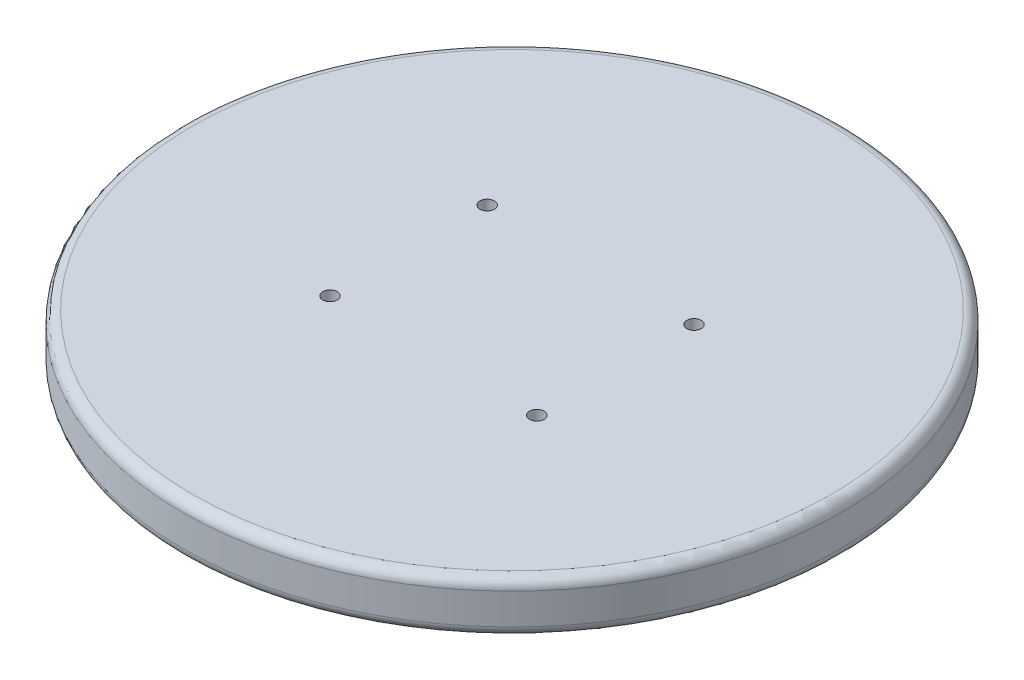
ISO-10303-21;
HEADER;
FILE_DESCRIPTION(('STEP AP214'),'2;1');
FILE_NAME('part.step','',(''),(''),'','','');
FILE_SCHEMA(('AUTOMOTIVE_DESIGN { 1 0 10303 214 1 1 1 1 }'));
ENDSEC;
DATA;
#1=APPLICATION_CONTEXT('core data for automotive mechanical design processes');
#2=APPLICATION_PROTOCOL_DEFINITION('international standard','automotive_design',2000,#1);
#3=PRODUCT_CONTEXT('',#1,'mechanical');
#4=PRODUCT('Part','Part','',(#3));
#5=PRODUCT_RELATED_PRODUCT_CATEGORY('part','',(#4));
#6=PRODUCT_DEFINITION_FORMATION('','',#4);
#7=PRODUCT_DEFINITION_CONTEXT('part definition',#1,'design');
#8=PRODUCT_DEFINITION('design','',#6,#7);
#9=PRODUCT_DEFINITION_SHAPE('','',#8);
#10=(LENGTH_UNIT() NAMED_UNIT(*) SI_UNIT(.MILLI.,.METRE.));
#11=(NAMED_UNIT(*) PLANE_ANGLE_UNIT() SI_UNIT($,.RADIAN.));
#12=(NAMED_UNIT(*) SI_UNIT($,.STERADIAN.) SOLID_ANGLE_UNIT());
#13=UNCERTAINTY_MEASURE_WITH_UNIT(LENGTH_MEASURE(1.E-05),#10,'distance_accuracy_value','');
#14=(GEOMETRIC_REPRESENTATION_CONTEXT(3) GLOBAL_UNCERTAINTY_ASSIGNED_CONTEXT((#13)) GLOBAL_UNIT_ASSIGNED_CONTEXT((#10,
#11,#12)) REPRESENTATION_CONTEXT('',''));
#15=CARTESIAN_POINT('',(0.,0.,0.));
#16=DIRECTION('',(0.,0.,1.));
#17=DIRECTION('',(1.,0.,0.));
#18=AXIS2_PLACEMENT_3D('',#15,#16,#17);
#19=CARTESIAN_POINT('',(0.,10.,0.));
#20=DIRECTION('',(0.,1.,0.));
#21=DIRECTION('',(0.,0.,1.));
#22=AXIS2_PLACEMENT_3D('',#19,#20,#21);
#23=PLANE('',#22);
#24=CARTESIAN_POINT('',(0.,10.,0.));
#25=DIRECTION('',(0.,1.,0.));
#26=DIRECTION('',(0.,0.,1.));
#27=AXIS2_PLACEMENT_3D('',#24,#25,#26);
#28=CIRCLE('',#27,61.7375421346438);
#29=CARTESIAN_POINT('',(0.,10.,61.7375421346438));
#30=VERTEX_POINT('',#29);
#31=EDGE_CURVE('E45',#30,#30,#28,.T.);
#32=ORIENTED_EDGE('',*,*,#31,.T.);
#33=EDGE_LOOP('',(#32));
#34=FACE_BOUND('',#33,.T.);
#35=CARTESIAN_POINT('',(-20.,10.,15.2));
#36=DIRECTION('',(0.,1.,0.));
#37=DIRECTION('',(0.,0.,-1.));
#38=AXIS2_PLACEMENT_3D('',#35,#36,#37);
#39=CIRCLE('',#38,1.4);
#40=CARTESIAN_POINT('',(-20.,10.,13.8));
#41=VERTEX_POINT('',#40);
#42=EDGE_CURVE('E74',#41,#41,#39,.T.);
#43=ORIENTED_EDGE('',*,*,#42,.F.);
#44=EDGE_LOOP('',(#43));
#45=FACE_BOUND('',#44,.T.);
#46=CARTESIAN_POINT('',(20.,10.,-15.2));
#47=DIRECTION('',(0.,1.,0.));
#48=DIRECTION('',(0.,0.,1.));
#49=AXIS2_PLACEMENT_3D('',#46,#47,#48);
#50=CIRCLE('',#49,1.4);
#51=CARTESIAN_POINT('',(20.,10.,-13.8));
#52=VERTEX_POINT('',#51);
#53=EDGE_CURVE('E61',#52,#52,#50,.T.);
#54=ORIENTED_EDGE('',*,*,#53,.F.);
#55=EDGE_LOOP('',(#54));
#56=FACE_BOUND('',#55,.T.);
#57=CARTESIAN_POINT('',(20.,10.,15.2));
#58=DIRECTION('',(0.,1.,0.));
#59=DIRECTION('',(0.,0.,1.));
#60=AXIS2_PLACEMENT_3D('',#57,#58,#59);
#61=CIRCLE('',#60,1.4);
#62=CARTESIAN_POINT('',(20.,10.,16.6));
#63=VERTEX_POINT('',#62);
#64=EDGE_CURVE('E66',#63,#63,#61,.T.);
#65=ORIENTED_EDGE('',*,*,#64,.F.);
#66=EDGE_LOOP('',(#65));
#67=FACE_BOUND('',#66,.T.);
#68=CARTESIAN_POINT('',(-20.,10.,-15.2));
#69=DIRECTION('',(0.,1.,0.));
#70=DIRECTION('',(0.,0.,-1.));
#71=AXIS2_PLACEMENT_3D('',#68,#69,#70);
#72=CIRCLE('',#71,1.4);
#73=CARTESIAN_POINT('',(-20.,10.,-16.6));
#74=VERTEX_POINT('',#73);
#75=EDGE_CURVE('E82',#74,#74,#72,.T.);
#76=ORIENTED_EDGE('',*,*,#75,.F.);
#77=EDGE_LOOP('',(#76));
#78=FACE_BOUND('',#77,.T.);
#79=ADVANCED_FACE('F37',(#34,#45,#56,#67,#78),#23,.T.);
#80=CARTESIAN_POINT('',(0.,0.,0.));
#81=DIRECTION('',(0.,1.,0.));
#82=DIRECTION('',(0.,0.,1.));
#83=AXIS2_PLACEMENT_3D('',#80,#81,#82);
#84=PLANE('',#83);
#85=CARTESIAN_POINT('',(0.,0.,0.));
#86=DIRECTION('',(0.,1.,0.));
#87=DIRECTION('',(0.,0.,1.));
#88=AXIS2_PLACEMENT_3D('',#85,#86,#87);
#89=CIRCLE('',#88,61.7375421346438);
#90=CARTESIAN_POINT('',(0.,0.,61.7375421346438));
#91=VERTEX_POINT('',#90);
#92=EDGE_CURVE('E50',#91,#91,#89,.F.);
#93=ORIENTED_EDGE('',*,*,#92,.T.);
#94=EDGE_LOOP('',(#93));
#95=FACE_BOUND('',#94,.T.);
#96=CARTESIAN_POINT('',(20.,0.,-15.2));
#97=DIRECTION('',(0.,1.,0.));
#98=DIRECTION('',(0.,0.,1.));
#99=AXIS2_PLACEMENT_3D('',#96,#97,#98);
#100=CIRCLE('',#99,1.4);
#101=CARTESIAN_POINT('',(20.,0.,-13.8));
#102=VERTEX_POINT('',#101);
#103=EDGE_CURVE('E62',#102,#102,#100,.T.);
#104=ORIENTED_EDGE('',*,*,#103,.T.);
#105=EDGE_LOOP('',(#104));
#106=FACE_BOUND('',#105,.T.);
#107=CARTESIAN_POINT('',(20.,0.,15.2));
#108=DIRECTION('',(0.,1.,0.));
#109=DIRECTION('',(0.,0.,1.));
#110=AXIS2_PLACEMENT_3D('',#107,#108,#109);
#111=CIRCLE('',#110,1.4);
#112=CARTESIAN_POINT('',(20.,0.,16.6));
#113=VERTEX_POINT('',#112);
#114=EDGE_CURVE('E70',#113,#113,#111,.T.);
#115=ORIENTED_EDGE('',*,*,#114,.T.);
#116=EDGE_LOOP('',(#115));
#117=FACE_BOUND('',#116,.T.);
#118=CARTESIAN_POINT('',(-20.,0.,15.2));
#119=DIRECTION('',(0.,1.,0.));
#120=DIRECTION('',(0.,0.,-1.));
#121=AXIS2_PLACEMENT_3D('',#118,#119,#120);
#122=CIRCLE('',#121,1.4);
#123=CARTESIAN_POINT('',(-20.,0.,13.8));
#124=VERTEX_POINT('',#123);
#125=EDGE_CURVE('E78',#124,#124,#122,.T.);
#126=ORIENTED_EDGE('',*,*,#125,.T.);
#127=EDGE_LOOP('',(#126));
#128=FACE_BOUND('',#127,.T.);
#129=CARTESIAN_POINT('',(-20.,0.,-15.2));
#130=DIRECTION('',(0.,1.,0.));
#131=DIRECTION('',(0.,0.,-1.));
#132=AXIS2_PLACEMENT_3D('',#129,#130,#131);
#133=CIRCLE('',#132,1.4);
#134=CARTESIAN_POINT('',(-20.,0.,-16.6));
#135=VERTEX_POINT('',#134);
#136=EDGE_CURVE('E86',#135,#135,#133,.T.);
#137=ORIENTED_EDGE('',*,*,#136,.T.);
#138=EDGE_LOOP('',(#137));
#139=FACE_BOUND('',#138,.T.);
#140=ADVANCED_FACE('F98',(#95,#106,#117,#128,#139),#84,.F.);
#141=CARTESIAN_POINT('',(0.,10.,0.));
#142=DIRECTION('',(0.,-1.,0.));
#143=DIRECTION('',(0.,0.,-1.));
#144=AXIS2_PLACEMENT_3D('',#141,#142,#143);
#145=CYLINDRICAL_SURFACE('',#144,63.7375421346438);
#146=CARTESIAN_POINT('',(0.,8.,0.));
#147=DIRECTION('',(0.,1.,0.));
#148=DIRECTION('',(0.,0.,1.));
#149=AXIS2_PLACEMENT_3D('',#146,#147,#148);
#150=CIRCLE('',#149,63.7375421346438);
#151=CARTESIAN_POINT('',(0.,8.,63.7375421346438));
#152=VERTEX_POINT('',#151);
#153=EDGE_CURVE('E10',#152,#152,#150,.F.);
#154=ORIENTED_EDGE('',*,*,#153,.T.);
#155=EDGE_LOOP('',(#154));
#156=FACE_BOUND('',#155,.T.);
#157=CARTESIAN_POINT('',(0.,2.,0.));
#158=DIRECTION('',(0.,1.,0.));
#159=DIRECTION('',(0.,0.,1.));
#160=AXIS2_PLACEMENT_3D('',#157,#158,#159);
#161=CIRCLE('',#160,63.7375421346438);
#162=CARTESIAN_POINT('',(0.,2.,63.7375421346438));
#163=VERTEX_POINT('',#162);
#164=EDGE_CURVE('E55',#163,#163,#161,.T.);
#165=ORIENTED_EDGE('',*,*,#164,.T.);
#166=EDGE_LOOP('',(#165));
#167=FACE_BOUND('',#166,.T.);
#168=ADVANCED_FACE('F103',(#156,#167),#145,.T.);
#169=CARTESIAN_POINT('',(20.,10.,-15.2));
#170=DIRECTION('',(0.,-1.,0.));
#171=DIRECTION('',(0.,0.,-1.));
#172=AXIS2_PLACEMENT_3D('',#169,#170,#171);
#173=CYLINDRICAL_SURFACE('',#172,1.4);
#174=ORIENTED_EDGE('',*,*,#53,.T.);
#175=EDGE_LOOP('',(#174));
#176=FACE_BOUND('',#175,.T.);
#177=ORIENTED_EDGE('',*,*,#103,.F.);
#178=EDGE_LOOP('',(#177));
#179=FACE_BOUND('',#178,.T.);
#180=ADVANCED_FACE('F108',(#176,#179),#173,.F.);
#181=CARTESIAN_POINT('',(20.,10.,15.2));
#182=DIRECTION('',(0.,-1.,0.));
#183=DIRECTION('',(0.,0.,-1.));
#184=AXIS2_PLACEMENT_3D('',#181,#182,#183);
#185=CYLINDRICAL_SURFACE('',#184,1.4);
#186=ORIENTED_EDGE('',*,*,#64,.T.);
#187=EDGE_LOOP('',(#186));
#188=FACE_BOUND('',#187,.T.);
#189=ORIENTED_EDGE('',*,*,#114,.F.);
#190=EDGE_LOOP('',(#189));
#191=FACE_BOUND('',#190,.T.);
#192=ADVANCED_FACE('F136',(#188,#191),#185,.F.);
#193=CARTESIAN_POINT('',(-20.,10.,15.2));
#194=DIRECTION('',(0.,-1.,0.));
#195=DIRECTION('',(0.,0.,-1.));
#196=AXIS2_PLACEMENT_3D('',#193,#194,#195);
#197=CYLINDRICAL_SURFACE('',#196,1.4);
#198=ORIENTED_EDGE('',*,*,#42,.T.);
#199=EDGE_LOOP('',(#198));
#200=FACE_BOUND('',#199,.T.);
#201=ORIENTED_EDGE('',*,*,#125,.F.);
#202=EDGE_LOOP('',(#201));
#203=FACE_BOUND('',#202,.T.);
#204=ADVANCED_FACE('F120',(#200,#203),#197,.F.);
#205=CARTESIAN_POINT('',(-20.,10.,-15.2));
#206=DIRECTION('',(0.,-1.,0.));
#207=DIRECTION('',(0.,0.,-1.));
#208=AXIS2_PLACEMENT_3D('',#205,#206,#207);
#209=CYLINDRICAL_SURFACE('',#208,1.4);
#210=ORIENTED_EDGE('',*,*,#75,.T.);
#211=EDGE_LOOP('',(#210));
#212=FACE_BOUND('',#211,.T.);
#213=ORIENTED_EDGE('',*,*,#136,.F.);
#214=EDGE_LOOP('',(#213));
#215=FACE_BOUND('',#214,.T.);
#216=ADVANCED_FACE('F94',(#212,#215),#209,.F.);
#217=CARTESIAN_POINT('',(0.,2.,0.));
#218=DIRECTION('',(0.,1.,0.));
#219=DIRECTION('',(0.,0.,1.));
#220=AXIS2_PLACEMENT_3D('',#217,#218,#219);
#221=TOROIDAL_SURFACE('',#220,61.7375421346438,2.);
#222=ORIENTED_EDGE('',*,*,#92,.F.);
#223=EDGE_LOOP('',(#222));
#224=FACE_BOUND('',#223,.T.);
#225=ORIENTED_EDGE('',*,*,#164,.F.);
#226=EDGE_LOOP('',(#225));
#227=FACE_BOUND('',#226,.T.);
#228=ADVANCED_FACE('F112',(#224,#227),#221,.T.);
#229=CARTESIAN_POINT('',(0.,8.,0.));
#230=DIRECTION('',(0.,1.,0.));
#231=DIRECTION('',(0.,0.,1.));
#232=AXIS2_PLACEMENT_3D('',#229,#230,#231);
#233=TOROIDAL_SURFACE('',#232,61.7375421346438,2.);
#234=ORIENTED_EDGE('',*,*,#153,.F.);
#235=EDGE_LOOP('',(#234));
#236=FACE_BOUND('',#235,.T.);
#237=ORIENTED_EDGE('',*,*,#31,.F.);
#238=EDGE_LOOP('',(#237));
#239=FACE_BOUND('',#238,.T.);
#240=ADVANCED_FACE('F39',(#236,#239),#233,.T.);
#241=CLOSED_SHELL('',(#79,#140,#168,#180,#192,#204,#216,#228,#240));
#242=MANIFOLD_SOLID_BREP('B2',#241);
#243=ADVANCED_BREP_SHAPE_REPRESENTATION('',(#18,#242),#14);
#244=SHAPE_DEFINITION_REPRESENTATION(#9,#243);
ENDSEC;
END-ISO-10303-21;
